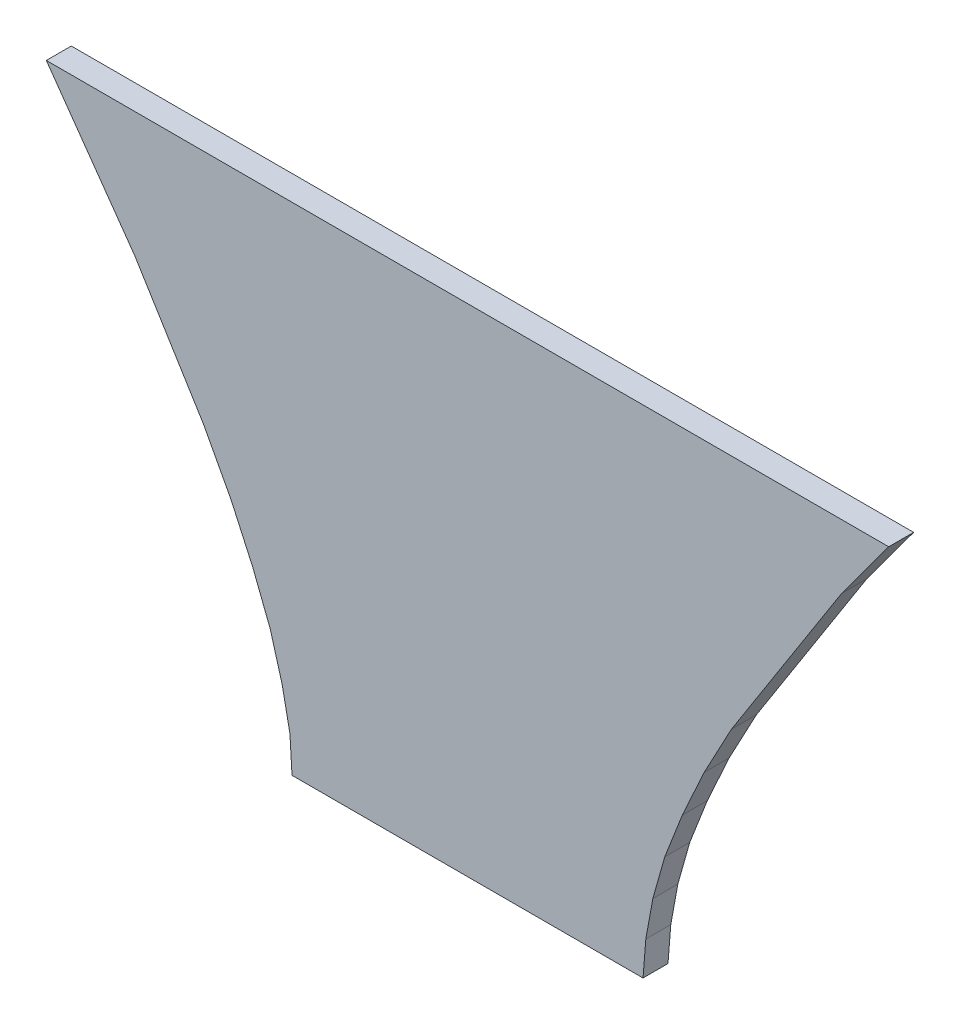
ISO-10303-21;
HEADER;
FILE_DESCRIPTION(('STEP AP214'),'2;1');
FILE_NAME('part.step','',(''),(''),'','','');
FILE_SCHEMA(('AUTOMOTIVE_DESIGN { 1 0 10303 214 1 1 1 1 }'));
ENDSEC;
DATA;
#1=APPLICATION_CONTEXT('core data for automotive mechanical design processes');
#2=APPLICATION_PROTOCOL_DEFINITION('international standard','automotive_design',2000,#1);
#3=PRODUCT_CONTEXT('',#1,'mechanical');
#4=PRODUCT('Part','Part','',(#3));
#5=PRODUCT_RELATED_PRODUCT_CATEGORY('part','',(#4));
#6=PRODUCT_DEFINITION_FORMATION('','',#4);
#7=PRODUCT_DEFINITION_CONTEXT('part definition',#1,'design');
#8=PRODUCT_DEFINITION('design','',#6,#7);
#9=PRODUCT_DEFINITION_SHAPE('','',#8);
#10=(LENGTH_UNIT() NAMED_UNIT(*) SI_UNIT(.MILLI.,.METRE.));
#11=(NAMED_UNIT(*) PLANE_ANGLE_UNIT() SI_UNIT($,.RADIAN.));
#12=(NAMED_UNIT(*) SI_UNIT($,.STERADIAN.) SOLID_ANGLE_UNIT());
#13=UNCERTAINTY_MEASURE_WITH_UNIT(LENGTH_MEASURE(1.E-05),#10,'distance_accuracy_value','');
#14=(GEOMETRIC_REPRESENTATION_CONTEXT(3) GLOBAL_UNCERTAINTY_ASSIGNED_CONTEXT((#13)) GLOBAL_UNIT_ASSIGNED_CONTEXT((#10,
#11,#12)) REPRESENTATION_CONTEXT('',''));
#15=CARTESIAN_POINT('',(0.,0.,0.));
#16=DIRECTION('',(0.,0.,1.));
#17=DIRECTION('',(1.,0.,0.));
#18=AXIS2_PLACEMENT_3D('',#15,#16,#17);
#19=CARTESIAN_POINT('',(94.0810012817383,93.0110015869141,0.));
#20=DIRECTION('',(-0.996818179936028,0.0797089464804637,0.));
#21=DIRECTION('',(0.0797089464804637,0.996818179936028,0.));
#22=AXIS2_PLACEMENT_3D('',#19,#20,#21);
#23=PLANE('',#22);
#24=DIRECTION('',(0.0797089464804637,0.996818179936028,0.));
#25=VECTOR('',#24,1.);
#26=CARTESIAN_POINT('',(94.0810012817383,93.0110015869141,0.03556));
#27=LINE('',#26,#25);
#28=CARTESIAN_POINT('',(94.0810012817383,93.0110015869141,0.03556));
#29=VERTEX_POINT('',#28);
#30=CARTESIAN_POINT('',(94.0849990844727,93.0609970092774,0.03556));
#31=VERTEX_POINT('',#30);
#32=EDGE_CURVE('E11',#29,#31,#27,.T.);
#33=ORIENTED_EDGE('',*,*,#32,.F.);
#34=DIRECTION('',(0.,0.,1.));
#35=VECTOR('',#34,1.);
#36=CARTESIAN_POINT('',(94.0810012817383,93.0110015869141,0.));
#37=LINE('',#36,#35);
#38=CARTESIAN_POINT('',(94.0810012817383,93.0110015869141,0.));
#39=VERTEX_POINT('',#38);
#40=EDGE_CURVE('E24',#39,#29,#37,.T.);
#41=ORIENTED_EDGE('',*,*,#40,.F.);
#42=DIRECTION('',(0.0797089464804637,0.996818179936028,0.));
#43=VECTOR('',#42,1.);
#44=CARTESIAN_POINT('',(94.0810012817383,93.0110015869141,0.));
#45=LINE('',#44,#43);
#46=CARTESIAN_POINT('',(94.0849990844727,93.0609970092774,0.));
#47=VERTEX_POINT('',#46);
#48=EDGE_CURVE('E160',#39,#47,#45,.T.);
#49=ORIENTED_EDGE('',*,*,#48,.T.);
#50=DIRECTION('',(0.,0.,1.));
#51=VECTOR('',#50,1.);
#52=CARTESIAN_POINT('',(94.0849990844727,93.0609970092774,0.));
#53=LINE('',#52,#51);
#54=EDGE_CURVE('E37',#47,#31,#53,.T.);
#55=ORIENTED_EDGE('',*,*,#54,.T.);
#56=EDGE_LOOP('',(#33,#41,#49,#55));
#57=FACE_BOUND('',#56,.T.);
#58=ADVANCED_FACE('F17',(#57),#23,.F.);
#59=CARTESIAN_POINT('',(94.0849990844727,93.0609970092774,0.));
#60=DIRECTION('',(-0.983863358539756,0.178921468032407,0.));
#61=DIRECTION('',(0.178921468032407,0.983863358539756,0.));
#62=AXIS2_PLACEMENT_3D('',#59,#60,#61);
#63=PLANE('',#62);
#64=DIRECTION('',(0.178921468032407,0.983863358539756,0.));
#65=VECTOR('',#64,1.);
#66=CARTESIAN_POINT('',(94.0849990844727,93.0609970092774,0.03556));
#67=LINE('',#66,#65);
#68=CARTESIAN_POINT('',(94.0950012207031,93.1159973144531,0.03556));
#69=VERTEX_POINT('',#68);
#70=EDGE_CURVE('E280',#31,#69,#67,.T.);
#71=ORIENTED_EDGE('',*,*,#70,.F.);
#72=ORIENTED_EDGE('',*,*,#54,.F.);
#73=DIRECTION('',(0.178921468032407,0.983863358539756,0.));
#74=VECTOR('',#73,1.);
#75=CARTESIAN_POINT('',(94.0849990844727,93.0609970092774,0.));
#76=LINE('',#75,#74);
#77=CARTESIAN_POINT('',(94.0950012207031,93.1159973144531,0.));
#78=VERTEX_POINT('',#77);
#79=EDGE_CURVE('E277',#47,#78,#76,.T.);
#80=ORIENTED_EDGE('',*,*,#79,.T.);
#81=DIRECTION('',(0.,0.,1.));
#82=VECTOR('',#81,1.);
#83=CARTESIAN_POINT('',(94.0950012207031,93.1159973144531,0.));
#84=LINE('',#83,#82);
#85=EDGE_CURVE('E275',#78,#69,#84,.T.);
#86=ORIENTED_EDGE('',*,*,#85,.T.);
#87=EDGE_LOOP('',(#71,#72,#80,#86));
#88=FACE_BOUND('',#87,.T.);
#89=ADVANCED_FACE('F288',(#88),#63,.F.);
#90=CARTESIAN_POINT('',(94.0950012207031,93.1159973144531,0.));
#91=DIRECTION('',(-0.962140093901354,0.272555388329589,0.));
#92=DIRECTION('',(0.272555388329589,0.962140093901354,0.));
#93=AXIS2_PLACEMENT_3D('',#90,#91,#92);
#94=PLANE('',#93);
#95=DIRECTION('',(0.272555388329589,0.962140093901354,0.));
#96=VECTOR('',#95,1.);
#97=CARTESIAN_POINT('',(94.0950012207031,93.1159973144531,0.03556));
#98=LINE('',#97,#96);
#99=CARTESIAN_POINT('',(94.1119995117188,93.1760025024414,0.03556));
#100=VERTEX_POINT('',#99);
#101=EDGE_CURVE('E272',#69,#100,#98,.T.);
#102=ORIENTED_EDGE('',*,*,#101,.F.);
#103=ORIENTED_EDGE('',*,*,#85,.F.);
#104=DIRECTION('',(0.272555388329589,0.962140093901354,0.));
#105=VECTOR('',#104,1.);
#106=CARTESIAN_POINT('',(94.0950012207031,93.1159973144531,0.));
#107=LINE('',#106,#105);
#108=CARTESIAN_POINT('',(94.1119995117188,93.1760025024414,0.));
#109=VERTEX_POINT('',#108);
#110=EDGE_CURVE('E269',#78,#109,#107,.T.);
#111=ORIENTED_EDGE('',*,*,#110,.T.);
#112=DIRECTION('',(0.,0.,1.));
#113=VECTOR('',#112,1.);
#114=CARTESIAN_POINT('',(94.1119995117188,93.1760025024414,0.));
#115=LINE('',#114,#113);
#116=EDGE_CURVE('E267',#109,#100,#115,.T.);
#117=ORIENTED_EDGE('',*,*,#116,.T.);
#118=EDGE_LOOP('',(#102,#103,#111,#117));
#119=FACE_BOUND('',#118,.T.);
#120=ADVANCED_FACE('F294',(#119),#94,.F.);
#121=CARTESIAN_POINT('',(94.1119995117188,93.1760025024414,0.));
#122=DIRECTION('',(-0.931440883557046,0.363892677088273,0.));
#123=DIRECTION('',(0.363892677088273,0.931440883557046,0.));
#124=AXIS2_PLACEMENT_3D('',#121,#122,#123);
#125=PLANE('',#124);
#126=DIRECTION('',(0.363892677088273,0.931440883557046,0.));
#127=VECTOR('',#126,1.);
#128=CARTESIAN_POINT('',(94.1119995117188,93.1760025024414,0.03556));
#129=LINE('',#128,#127);
#130=CARTESIAN_POINT('',(94.1370010375977,93.2399978637695,0.03556));
#131=VERTEX_POINT('',#130);
#132=EDGE_CURVE('E264',#100,#131,#129,.T.);
#133=ORIENTED_EDGE('',*,*,#132,.F.);
#134=ORIENTED_EDGE('',*,*,#116,.F.);
#135=DIRECTION('',(0.363892677088273,0.931440883557046,0.));
#136=VECTOR('',#135,1.);
#137=CARTESIAN_POINT('',(94.1119995117188,93.1760025024414,0.));
#138=LINE('',#137,#136);
#139=CARTESIAN_POINT('',(94.1370010375977,93.2399978637695,0.));
#140=VERTEX_POINT('',#139);
#141=EDGE_CURVE('E261',#109,#140,#138,.T.);
#142=ORIENTED_EDGE('',*,*,#141,.T.);
#143=DIRECTION('',(0.,0.,1.));
#144=VECTOR('',#143,1.);
#145=CARTESIAN_POINT('',(94.1370010375977,93.2399978637695,0.));
#146=LINE('',#145,#144);
#147=EDGE_CURVE('E259',#140,#131,#146,.T.);
#148=ORIENTED_EDGE('',*,*,#147,.T.);
#149=EDGE_LOOP('',(#133,#134,#142,#148));
#150=FACE_BOUND('',#149,.T.);
#151=ADVANCED_FACE('F296',(#150),#125,.F.);
#152=CARTESIAN_POINT('',(94.1370010375977,93.2399978637695,0.));
#153=DIRECTION('',(-0.909918432077323,0.414787230958169,0.));
#154=DIRECTION('',(0.414787230958169,0.909918432077323,0.));
#155=AXIS2_PLACEMENT_3D('',#152,#153,#154);
#156=PLANE('',#155);
#157=DIRECTION('',(0.414787230958169,0.909918432077323,0.));
#158=VECTOR('',#157,1.);
#159=CARTESIAN_POINT('',(94.1370010375977,93.2399978637695,0.03556));
#160=LINE('',#159,#158);
#161=CARTESIAN_POINT('',(94.1679992675781,93.3079986572266,0.03556));
#162=VERTEX_POINT('',#161);
#163=EDGE_CURVE('E256',#131,#162,#160,.T.);
#164=ORIENTED_EDGE('',*,*,#163,.F.);
#165=ORIENTED_EDGE('',*,*,#147,.F.);
#166=DIRECTION('',(0.414787230958169,0.909918432077323,0.));
#167=VECTOR('',#166,1.);
#168=CARTESIAN_POINT('',(94.1370010375977,93.2399978637695,0.));
#169=LINE('',#168,#167);
#170=CARTESIAN_POINT('',(94.1679992675781,93.3079986572266,0.));
#171=VERTEX_POINT('',#170);
#172=EDGE_CURVE('E253',#140,#171,#169,.T.);
#173=ORIENTED_EDGE('',*,*,#172,.T.);
#174=DIRECTION('',(0.,0.,1.));
#175=VECTOR('',#174,1.);
#176=CARTESIAN_POINT('',(94.1679992675781,93.3079986572266,0.));
#177=LINE('',#176,#175);
#178=EDGE_CURVE('E251',#171,#162,#177,.T.);
#179=ORIENTED_EDGE('',*,*,#178,.T.);
#180=EDGE_LOOP('',(#164,#165,#173,#179));
#181=FACE_BOUND('',#180,.T.);
#182=ADVANCED_FACE('F301',(#181),#156,.F.);
#183=CARTESIAN_POINT('',(94.1679992675781,93.3079986572266,0.));
#184=DIRECTION('',(-0.882005659864837,0.471238809911062,0.));
#185=DIRECTION('',(0.471238809911062,0.882005659864837,0.));
#186=AXIS2_PLACEMENT_3D('',#183,#184,#185);
#187=PLANE('',#186);
#188=DIRECTION('',(0.471238809911062,0.882005659864837,0.));
#189=VECTOR('',#188,1.);
#190=CARTESIAN_POINT('',(94.1679992675781,93.3079986572266,0.03556));
#191=LINE('',#190,#189);
#192=CARTESIAN_POINT('',(94.2070007324219,93.3809967041016,0.03556));
#193=VERTEX_POINT('',#192);
#194=EDGE_CURVE('E248',#162,#193,#191,.T.);
#195=ORIENTED_EDGE('',*,*,#194,.F.);
#196=ORIENTED_EDGE('',*,*,#178,.F.);
#197=DIRECTION('',(0.471238809911062,0.882005659864837,0.));
#198=VECTOR('',#197,1.);
#199=CARTESIAN_POINT('',(94.1679992675781,93.3079986572266,0.));
#200=LINE('',#199,#198);
#201=CARTESIAN_POINT('',(94.2070007324219,93.3809967041016,0.));
#202=VERTEX_POINT('',#201);
#203=EDGE_CURVE('E245',#171,#202,#200,.T.);
#204=ORIENTED_EDGE('',*,*,#203,.T.);
#205=DIRECTION('',(0.,0.,1.));
#206=VECTOR('',#205,1.);
#207=CARTESIAN_POINT('',(94.2070007324219,93.3809967041016,0.));
#208=LINE('',#207,#206);
#209=EDGE_CURVE('E243',#202,#193,#208,.T.);
#210=ORIENTED_EDGE('',*,*,#209,.T.);
#211=EDGE_LOOP('',(#195,#196,#204,#210));
#212=FACE_BOUND('',#211,.T.);
#213=ADVANCED_FACE('F304',(#212),#187,.F.);
#214=CARTESIAN_POINT('',(94.2070007324219,93.3809967041016,0.));
#215=DIRECTION('',(-0.842961056380981,0.537974588084847,0.));
#216=DIRECTION('',(0.537974588084847,0.842961056380981,0.));
#217=AXIS2_PLACEMENT_3D('',#214,#215,#216);
#218=PLANE('',#217);
#219=DIRECTION('',(0.537974588084847,0.842961056380981,0.));
#220=VECTOR('',#219,1.);
#221=CARTESIAN_POINT('',(94.2070007324219,93.3809967041016,0.03556));
#222=LINE('',#221,#220);
#223=CARTESIAN_POINT('',(94.3639984130859,93.6269989013672,0.03556));
#224=VERTEX_POINT('',#223);
#225=EDGE_CURVE('E240',#193,#224,#222,.T.);
#226=ORIENTED_EDGE('',*,*,#225,.F.);
#227=ORIENTED_EDGE('',*,*,#209,.F.);
#228=DIRECTION('',(0.537974588084847,0.842961056380981,0.));
#229=VECTOR('',#228,1.);
#230=CARTESIAN_POINT('',(94.2070007324219,93.3809967041016,0.));
#231=LINE('',#230,#229);
#232=CARTESIAN_POINT('',(94.3639984130859,93.6269989013672,0.));
#233=VERTEX_POINT('',#232);
#234=EDGE_CURVE('E237',#202,#233,#231,.T.);
#235=ORIENTED_EDGE('',*,*,#234,.T.);
#236=DIRECTION('',(0.,0.,1.));
#237=VECTOR('',#236,1.);
#238=CARTESIAN_POINT('',(94.3639984130859,93.6269989013672,0.));
#239=LINE('',#238,#237);
#240=EDGE_CURVE('E235',#233,#224,#239,.T.);
#241=ORIENTED_EDGE('',*,*,#240,.T.);
#242=EDGE_LOOP('',(#226,#227,#235,#241));
#243=FACE_BOUND('',#242,.T.);
#244=ADVANCED_FACE('F309',(#243),#218,.F.);
#245=CARTESIAN_POINT('',(94.363998413086,93.6269989013672,0.));
#246=DIRECTION('',(-0.805283161541302,0.592890402804805,0.));
#247=DIRECTION('',(0.592890402804805,0.805283161541302,0.));
#248=AXIS2_PLACEMENT_3D('',#245,#246,#247);
#249=PLANE('',#248);
#250=DIRECTION('',(0.592890402804805,0.805283161541302,0.));
#251=VECTOR('',#250,1.);
#252=CARTESIAN_POINT('',(94.3639984130859,93.6269989013672,0.03556));
#253=LINE('',#252,#251);
#254=CARTESIAN_POINT('',(94.4309997558594,93.7180023193359,0.03556));
#255=VERTEX_POINT('',#254);
#256=EDGE_CURVE('E232',#224,#255,#253,.T.);
#257=ORIENTED_EDGE('',*,*,#256,.F.);
#258=ORIENTED_EDGE('',*,*,#240,.F.);
#259=DIRECTION('',(0.592890402804805,0.805283161541302,0.));
#260=VECTOR('',#259,1.);
#261=CARTESIAN_POINT('',(94.3639984130859,93.6269989013672,0.));
#262=LINE('',#261,#260);
#263=CARTESIAN_POINT('',(94.4309997558594,93.7180023193359,0.));
#264=VERTEX_POINT('',#263);
#265=EDGE_CURVE('E229',#233,#264,#262,.T.);
#266=ORIENTED_EDGE('',*,*,#265,.T.);
#267=DIRECTION('',(0.,0.,1.));
#268=VECTOR('',#267,1.);
#269=CARTESIAN_POINT('',(94.4309997558594,93.7180023193359,0.));
#270=LINE('',#269,#268);
#271=EDGE_CURVE('E227',#264,#255,#270,.T.);
#272=ORIENTED_EDGE('',*,*,#271,.T.);
#273=EDGE_LOOP('',(#257,#258,#266,#272));
#274=FACE_BOUND('',#273,.T.);
#275=ADVANCED_FACE('F312',(#274),#249,.F.);
#276=CARTESIAN_POINT('',(94.4309997558594,93.7180023193359,0.));
#277=DIRECTION('',(0.,-1.,0.));
#278=DIRECTION('',(-1.,0.,0.));
#279=AXIS2_PLACEMENT_3D('',#276,#277,#278);
#280=PLANE('',#279);
#281=DIRECTION('',(-1.,0.,0.));
#282=VECTOR('',#281,1.);
#283=CARTESIAN_POINT('',(94.4309997558594,93.7180023193359,0.03556));
#284=LINE('',#283,#282);
#285=CARTESIAN_POINT('',(93.2310028076172,93.7180023193359,0.03556));
#286=VERTEX_POINT('',#285);
#287=EDGE_CURVE('E224',#255,#286,#284,.T.);
#288=ORIENTED_EDGE('',*,*,#287,.F.);
#289=ORIENTED_EDGE('',*,*,#271,.F.);
#290=DIRECTION('',(-1.,0.,0.));
#291=VECTOR('',#290,1.);
#292=CARTESIAN_POINT('',(94.4309997558594,93.7180023193359,0.));
#293=LINE('',#292,#291);
#294=CARTESIAN_POINT('',(93.2310028076172,93.7180023193359,0.));
#295=VERTEX_POINT('',#294);
#296=EDGE_CURVE('E221',#264,#295,#293,.T.);
#297=ORIENTED_EDGE('',*,*,#296,.T.);
#298=DIRECTION('',(0.,0.,1.));
#299=VECTOR('',#298,1.);
#300=CARTESIAN_POINT('',(93.2310028076172,93.7180023193359,0.));
#301=LINE('',#300,#299);
#302=EDGE_CURVE('E219',#295,#286,#301,.T.);
#303=ORIENTED_EDGE('',*,*,#302,.T.);
#304=EDGE_LOOP('',(#288,#289,#297,#303));
#305=FACE_BOUND('',#304,.T.);
#306=ADVANCED_FACE('F317',(#305),#280,.F.);
#307=CARTESIAN_POINT('',(93.2310028076172,93.7180023193359,0.));
#308=DIRECTION('',(0.816208014118673,0.577758148093519,0.));
#309=DIRECTION('',(0.577758148093519,-0.816208014118673,0.));
#310=AXIS2_PLACEMENT_3D('',#307,#308,#309);
#311=PLANE('',#310);
#312=DIRECTION('',(0.577758148093519,-0.816208014118673,0.));
#313=VECTOR('',#312,1.);
#314=CARTESIAN_POINT('',(93.2310028076172,93.7180023193359,0.03556));
#315=LINE('',#314,#313);
#316=CARTESIAN_POINT('',(93.3570022583008,93.5400009155273,0.03556));
#317=VERTEX_POINT('',#316);
#318=EDGE_CURVE('E216',#286,#317,#315,.T.);
#319=ORIENTED_EDGE('',*,*,#318,.F.);
#320=ORIENTED_EDGE('',*,*,#302,.F.);
#321=DIRECTION('',(0.577758148093519,-0.816208014118673,0.));
#322=VECTOR('',#321,1.);
#323=CARTESIAN_POINT('',(93.2310028076172,93.7180023193359,0.));
#324=LINE('',#323,#322);
#325=CARTESIAN_POINT('',(93.3570022583008,93.5400009155273,0.));
#326=VERTEX_POINT('',#325);
#327=EDGE_CURVE('E213',#295,#326,#324,.T.);
#328=ORIENTED_EDGE('',*,*,#327,.T.);
#329=DIRECTION('',(0.,0.,1.));
#330=VECTOR('',#329,1.);
#331=CARTESIAN_POINT('',(93.3570022583008,93.5400009155273,0.));
#332=LINE('',#331,#330);
#333=EDGE_CURVE('E211',#326,#317,#332,.T.);
#334=ORIENTED_EDGE('',*,*,#333,.T.);
#335=EDGE_LOOP('',(#319,#320,#328,#334));
#336=FACE_BOUND('',#335,.T.);
#337=ADVANCED_FACE('F320',(#336),#311,.F.);
#338=CARTESIAN_POINT('',(93.3570022583008,93.5400009155273,0.));
#339=DIRECTION('',(0.851297677702986,0.524683012815837,0.));
#340=DIRECTION('',(0.524683012815837,-0.851297677702986,0.));
#341=AXIS2_PLACEMENT_3D('',#338,#339,#340);
#342=PLANE('',#341);
#343=DIRECTION('',(0.524683012815837,-0.851297677702986,0.));
#344=VECTOR('',#343,1.);
#345=CARTESIAN_POINT('',(93.3570022583008,93.5400009155273,0.03556));
#346=LINE('',#345,#344);
#347=CARTESIAN_POINT('',(93.4550018310547,93.3809967041016,0.03556));
#348=VERTEX_POINT('',#347);
#349=EDGE_CURVE('E208',#317,#348,#346,.T.);
#350=ORIENTED_EDGE('',*,*,#349,.F.);
#351=ORIENTED_EDGE('',*,*,#333,.F.);
#352=DIRECTION('',(0.524683012815837,-0.851297677702986,0.));
#353=VECTOR('',#352,1.);
#354=CARTESIAN_POINT('',(93.3570022583008,93.5400009155273,0.));
#355=LINE('',#354,#353);
#356=CARTESIAN_POINT('',(93.4550018310547,93.3809967041016,0.));
#357=VERTEX_POINT('',#356);
#358=EDGE_CURVE('E205',#326,#357,#355,.T.);
#359=ORIENTED_EDGE('',*,*,#358,.T.);
#360=DIRECTION('',(0.,0.,1.));
#361=VECTOR('',#360,1.);
#362=CARTESIAN_POINT('',(93.4550018310547,93.3809967041016,0.));
#363=LINE('',#362,#361);
#364=EDGE_CURVE('E203',#357,#348,#363,.T.);
#365=ORIENTED_EDGE('',*,*,#364,.T.);
#366=EDGE_LOOP('',(#350,#351,#359,#365));
#367=FACE_BOUND('',#366,.T.);
#368=ADVANCED_FACE('F325',(#367),#342,.F.);
#369=CARTESIAN_POINT('',(93.4550018310547,93.3809967041016,0.));
#370=DIRECTION('',(0.882005659864837,0.471238809911062,0.));
#371=DIRECTION('',(0.471238809911062,-0.882005659864837,0.));
#372=AXIS2_PLACEMENT_3D('',#369,#370,#371);
#373=PLANE('',#372);
#374=DIRECTION('',(0.471238809911062,-0.882005659864837,0.));
#375=VECTOR('',#374,1.);
#376=CARTESIAN_POINT('',(93.4550018310547,93.3809967041016,0.03556));
#377=LINE('',#376,#375);
#378=CARTESIAN_POINT('',(93.4940032958984,93.3079986572266,0.03556));
#379=VERTEX_POINT('',#378);
#380=EDGE_CURVE('E200',#348,#379,#377,.T.);
#381=ORIENTED_EDGE('',*,*,#380,.F.);
#382=ORIENTED_EDGE('',*,*,#364,.F.);
#383=DIRECTION('',(0.471238809911062,-0.882005659864837,0.));
#384=VECTOR('',#383,1.);
#385=CARTESIAN_POINT('',(93.4550018310547,93.3809967041016,0.));
#386=LINE('',#385,#384);
#387=CARTESIAN_POINT('',(93.4940032958984,93.3079986572266,0.));
#388=VERTEX_POINT('',#387);
#389=EDGE_CURVE('E197',#357,#388,#386,.T.);
#390=ORIENTED_EDGE('',*,*,#389,.T.);
#391=DIRECTION('',(0.,0.,1.));
#392=VECTOR('',#391,1.);
#393=CARTESIAN_POINT('',(93.4940032958984,93.3079986572266,0.));
#394=LINE('',#393,#392);
#395=EDGE_CURVE('E195',#388,#379,#394,.T.);
#396=ORIENTED_EDGE('',*,*,#395,.T.);
#397=EDGE_LOOP('',(#381,#382,#390,#396));
#398=FACE_BOUND('',#397,.T.);
#399=ADVANCED_FACE('F328',(#398),#373,.F.);
#400=CARTESIAN_POINT('',(93.4940032958984,93.3079986572266,0.));
#401=DIRECTION('',(0.909918432077323,0.414787230958169,0.));
#402=DIRECTION('',(0.414787230958169,-0.909918432077323,0.));
#403=AXIS2_PLACEMENT_3D('',#400,#401,#402);
#404=PLANE('',#403);
#405=DIRECTION('',(0.414787230958169,-0.909918432077323,0.));
#406=VECTOR('',#405,1.);
#407=CARTESIAN_POINT('',(93.4940032958984,93.3079986572266,0.03556));
#408=LINE('',#407,#406);
#409=CARTESIAN_POINT('',(93.5250015258789,93.2399978637695,0.03556));
#410=VERTEX_POINT('',#409);
#411=EDGE_CURVE('E192',#379,#410,#408,.T.);
#412=ORIENTED_EDGE('',*,*,#411,.F.);
#413=ORIENTED_EDGE('',*,*,#395,.F.);
#414=DIRECTION('',(0.414787230958169,-0.909918432077323,0.));
#415=VECTOR('',#414,1.);
#416=CARTESIAN_POINT('',(93.4940032958984,93.3079986572266,0.));
#417=LINE('',#416,#415);
#418=CARTESIAN_POINT('',(93.5250015258789,93.2399978637695,0.));
#419=VERTEX_POINT('',#418);
#420=EDGE_CURVE('E189',#388,#419,#417,.T.);
#421=ORIENTED_EDGE('',*,*,#420,.T.);
#422=DIRECTION('',(0.,0.,1.));
#423=VECTOR('',#422,1.);
#424=CARTESIAN_POINT('',(93.5250015258789,93.2399978637695,0.));
#425=LINE('',#424,#423);
#426=EDGE_CURVE('E187',#419,#410,#425,.T.);
#427=ORIENTED_EDGE('',*,*,#426,.T.);
#428=EDGE_LOOP('',(#412,#413,#421,#427));
#429=FACE_BOUND('',#428,.T.);
#430=ADVANCED_FACE('F333',(#429),#404,.F.);
#431=CARTESIAN_POINT('',(93.5250015258789,93.2399978637695,0.));
#432=DIRECTION('',(0.931440883557046,0.363892677088273,0.));
#433=DIRECTION('',(0.363892677088273,-0.931440883557046,0.));
#434=AXIS2_PLACEMENT_3D('',#431,#432,#433);
#435=PLANE('',#434);
#436=DIRECTION('',(0.363892677088273,-0.931440883557046,0.));
#437=VECTOR('',#436,1.);
#438=CARTESIAN_POINT('',(93.5250015258789,93.2399978637695,0.03556));
#439=LINE('',#438,#437);
#440=CARTESIAN_POINT('',(93.5500030517578,93.1760025024414,0.03556));
#441=VERTEX_POINT('',#440);
#442=EDGE_CURVE('E184',#410,#441,#439,.T.);
#443=ORIENTED_EDGE('',*,*,#442,.F.);
#444=ORIENTED_EDGE('',*,*,#426,.F.);
#445=DIRECTION('',(0.363892677088273,-0.931440883557046,0.));
#446=VECTOR('',#445,1.);
#447=CARTESIAN_POINT('',(93.5250015258789,93.2399978637695,0.));
#448=LINE('',#447,#446);
#449=CARTESIAN_POINT('',(93.5500030517578,93.1760025024414,0.));
#450=VERTEX_POINT('',#449);
#451=EDGE_CURVE('E181',#419,#450,#448,.T.);
#452=ORIENTED_EDGE('',*,*,#451,.T.);
#453=DIRECTION('',(0.,0.,1.));
#454=VECTOR('',#453,1.);
#455=CARTESIAN_POINT('',(93.5500030517578,93.1760025024414,0.));
#456=LINE('',#455,#454);
#457=EDGE_CURVE('E179',#450,#441,#456,.T.);
#458=ORIENTED_EDGE('',*,*,#457,.T.);
#459=EDGE_LOOP('',(#443,#444,#452,#458));
#460=FACE_BOUND('',#459,.T.);
#461=ADVANCED_FACE('F336',(#460),#435,.F.);
#462=CARTESIAN_POINT('',(93.5500030517578,93.1760025024414,0.));
#463=DIRECTION('',(0.962140093901354,0.272555388329589,0.));
#464=DIRECTION('',(0.272555388329589,-0.962140093901354,0.));
#465=AXIS2_PLACEMENT_3D('',#462,#463,#464);
#466=PLANE('',#465);
#467=DIRECTION('',(0.272555388329589,-0.962140093901354,0.));
#468=VECTOR('',#467,1.);
#469=CARTESIAN_POINT('',(93.5500030517578,93.1760025024414,0.03556));
#470=LINE('',#469,#468);
#471=CARTESIAN_POINT('',(93.5670013427734,93.1159973144531,0.03556));
#472=VERTEX_POINT('',#471);
#473=EDGE_CURVE('E176',#441,#472,#470,.T.);
#474=ORIENTED_EDGE('',*,*,#473,.F.);
#475=ORIENTED_EDGE('',*,*,#457,.F.);
#476=DIRECTION('',(0.272555388329589,-0.962140093901354,0.));
#477=VECTOR('',#476,1.);
#478=CARTESIAN_POINT('',(93.5500030517578,93.1760025024414,0.));
#479=LINE('',#478,#477);
#480=CARTESIAN_POINT('',(93.5670013427734,93.1159973144531,0.));
#481=VERTEX_POINT('',#480);
#482=EDGE_CURVE('E173',#450,#481,#479,.T.);
#483=ORIENTED_EDGE('',*,*,#482,.T.);
#484=DIRECTION('',(0.,0.,1.));
#485=VECTOR('',#484,1.);
#486=CARTESIAN_POINT('',(93.5670013427734,93.1159973144531,0.));
#487=LINE('',#486,#485);
#488=EDGE_CURVE('E171',#481,#472,#487,.T.);
#489=ORIENTED_EDGE('',*,*,#488,.T.);
#490=EDGE_LOOP('',(#474,#475,#483,#489));
#491=FACE_BOUND('',#490,.T.);
#492=ADVANCED_FACE('F341',(#491),#466,.F.);
#493=CARTESIAN_POINT('',(93.5670013427735,93.1159973144531,0.));
#494=DIRECTION('',(0.980575443764812,0.196142292954482,0.));
#495=DIRECTION('',(0.196142292954482,-0.980575443764812,0.));
#496=AXIS2_PLACEMENT_3D('',#493,#494,#495);
#497=PLANE('',#496);
#498=DIRECTION('',(0.196142292954482,-0.980575443764812,0.));
#499=VECTOR('',#498,1.);
#500=CARTESIAN_POINT('',(93.5670013427734,93.1159973144531,0.03556));
#501=LINE('',#500,#499);
#502=CARTESIAN_POINT('',(93.5780029296875,93.0609970092774,0.03556));
#503=VERTEX_POINT('',#502);
#504=EDGE_CURVE('E168',#472,#503,#501,.T.);
#505=ORIENTED_EDGE('',*,*,#504,.F.);
#506=ORIENTED_EDGE('',*,*,#488,.F.);
#507=DIRECTION('',(0.196142292954482,-0.980575443764812,0.));
#508=VECTOR('',#507,1.);
#509=CARTESIAN_POINT('',(93.5670013427734,93.1159973144531,0.));
#510=LINE('',#509,#508);
#511=CARTESIAN_POINT('',(93.5780029296875,93.0609970092774,0.));
#512=VERTEX_POINT('',#511);
#513=EDGE_CURVE('E166',#481,#512,#510,.T.);
#514=ORIENTED_EDGE('',*,*,#513,.T.);
#515=DIRECTION('',(0.,0.,1.));
#516=VECTOR('',#515,1.);
#517=CARTESIAN_POINT('',(93.5780029296875,93.0609970092774,0.));
#518=LINE('',#517,#516);
#519=EDGE_CURVE('E151',#512,#503,#518,.T.);
#520=ORIENTED_EDGE('',*,*,#519,.T.);
#521=EDGE_LOOP('',(#505,#506,#514,#520));
#522=FACE_BOUND('',#521,.T.);
#523=ADVANCED_FACE('F343',(#522),#497,.F.);
#524=CARTESIAN_POINT('',(93.5780029296875,93.0609970092774,0.));
#525=DIRECTION('',(0.998206484334836,0.0598649699898658,0.));
#526=DIRECTION('',(0.0598649699898658,-0.998206484334836,0.));
#527=AXIS2_PLACEMENT_3D('',#524,#525,#526);
#528=PLANE('',#527);
#529=DIRECTION('',(0.0598649699898658,-0.998206484334836,0.));
#530=VECTOR('',#529,1.);
#531=CARTESIAN_POINT('',(93.5780029296875,93.0609970092774,0.03556));
#532=LINE('',#531,#530);
#533=CARTESIAN_POINT('',(93.5810012817383,93.0110015869141,0.03556));
#534=VERTEX_POINT('',#533);
#535=EDGE_CURVE('E155',#503,#534,#532,.T.);
#536=ORIENTED_EDGE('',*,*,#535,.F.);
#537=ORIENTED_EDGE('',*,*,#519,.F.);
#538=DIRECTION('',(0.0598649699898658,-0.998206484334836,0.));
#539=VECTOR('',#538,1.);
#540=CARTESIAN_POINT('',(93.5780029296875,93.0609970092774,0.));
#541=LINE('',#540,#539);
#542=CARTESIAN_POINT('',(93.5810012817383,93.0110015869141,0.));
#543=VERTEX_POINT('',#542);
#544=EDGE_CURVE('E147',#512,#543,#541,.T.);
#545=ORIENTED_EDGE('',*,*,#544,.T.);
#546=DIRECTION('',(0.,0.,1.));
#547=VECTOR('',#546,1.);
#548=CARTESIAN_POINT('',(93.5810012817383,93.0110015869141,0.));
#549=LINE('',#548,#547);
#550=EDGE_CURVE('E137',#543,#534,#549,.T.);
#551=ORIENTED_EDGE('',*,*,#550,.T.);
#552=EDGE_LOOP('',(#536,#537,#545,#551));
#553=FACE_BOUND('',#552,.T.);
#554=ADVANCED_FACE('F150',(#553),#528,.F.);
#555=CARTESIAN_POINT('',(93.5810012817383,93.0110015869141,0.));
#556=DIRECTION('',(0.,1.,0.));
#557=DIRECTION('',(1.,0.,0.));
#558=AXIS2_PLACEMENT_3D('',#555,#556,#557);
#559=PLANE('',#558);
#560=DIRECTION('',(1.,0.,0.));
#561=VECTOR('',#560,1.);
#562=CARTESIAN_POINT('',(93.5810012817383,93.0110015869141,0.03556));
#563=LINE('',#562,#561);
#564=EDGE_CURVE('E143',#534,#29,#563,.T.);
#565=ORIENTED_EDGE('',*,*,#564,.F.);
#566=ORIENTED_EDGE('',*,*,#550,.F.);
#567=DIRECTION('',(1.,0.,0.));
#568=VECTOR('',#567,1.);
#569=CARTESIAN_POINT('',(93.5810012817383,93.0110015869141,0.));
#570=LINE('',#569,#568);
#571=EDGE_CURVE('E141',#543,#39,#570,.T.);
#572=ORIENTED_EDGE('',*,*,#571,.T.);
#573=ORIENTED_EDGE('',*,*,#40,.T.);
#574=EDGE_LOOP('',(#565,#566,#572,#573));
#575=FACE_BOUND('',#574,.T.);
#576=ADVANCED_FACE('F139',(#575),#559,.F.);
#577=CARTESIAN_POINT('',(94.0810012817383,93.0110015869141,0.));
#578=DIRECTION('',(0.,0.,1.));
#579=DIRECTION('',(1.,0.,0.));
#580=AXIS2_PLACEMENT_3D('',#577,#578,#579);
#581=PLANE('',#580);
#582=ORIENTED_EDGE('',*,*,#571,.F.);
#583=ORIENTED_EDGE('',*,*,#544,.F.);
#584=ORIENTED_EDGE('',*,*,#513,.F.);
#585=ORIENTED_EDGE('',*,*,#482,.F.);
#586=ORIENTED_EDGE('',*,*,#451,.F.);
#587=ORIENTED_EDGE('',*,*,#420,.F.);
#588=ORIENTED_EDGE('',*,*,#389,.F.);
#589=ORIENTED_EDGE('',*,*,#358,.F.);
#590=ORIENTED_EDGE('',*,*,#327,.F.);
#591=ORIENTED_EDGE('',*,*,#296,.F.);
#592=ORIENTED_EDGE('',*,*,#265,.F.);
#593=ORIENTED_EDGE('',*,*,#234,.F.);
#594=ORIENTED_EDGE('',*,*,#203,.F.);
#595=ORIENTED_EDGE('',*,*,#172,.F.);
#596=ORIENTED_EDGE('',*,*,#141,.F.);
#597=ORIENTED_EDGE('',*,*,#110,.F.);
#598=ORIENTED_EDGE('',*,*,#79,.F.);
#599=ORIENTED_EDGE('',*,*,#48,.F.);
#600=EDGE_LOOP('',(#582,#583,#584,#585,#586,#587,#588,#589,#590,#591,#592,#593,#594,#595,#596,
#597,#598,#599));
#601=FACE_BOUND('',#600,.T.);
#602=ADVANCED_FACE('F158',(#601),#581,.F.);
#603=CARTESIAN_POINT('',(94.0810012817383,93.0110015869141,0.03556));
#604=DIRECTION('',(0.,0.,1.));
#605=DIRECTION('',(1.,0.,0.));
#606=AXIS2_PLACEMENT_3D('',#603,#604,#605);
#607=PLANE('',#606);
#608=ORIENTED_EDGE('',*,*,#32,.T.);
#609=ORIENTED_EDGE('',*,*,#70,.T.);
#610=ORIENTED_EDGE('',*,*,#101,.T.);
#611=ORIENTED_EDGE('',*,*,#132,.T.);
#612=ORIENTED_EDGE('',*,*,#163,.T.);
#613=ORIENTED_EDGE('',*,*,#194,.T.);
#614=ORIENTED_EDGE('',*,*,#225,.T.);
#615=ORIENTED_EDGE('',*,*,#256,.T.);
#616=ORIENTED_EDGE('',*,*,#287,.T.);
#617=ORIENTED_EDGE('',*,*,#318,.T.);
#618=ORIENTED_EDGE('',*,*,#349,.T.);
#619=ORIENTED_EDGE('',*,*,#380,.T.);
#620=ORIENTED_EDGE('',*,*,#411,.T.);
#621=ORIENTED_EDGE('',*,*,#442,.T.);
#622=ORIENTED_EDGE('',*,*,#473,.T.);
#623=ORIENTED_EDGE('',*,*,#504,.T.);
#624=ORIENTED_EDGE('',*,*,#535,.T.);
#625=ORIENTED_EDGE('',*,*,#564,.T.);
#626=EDGE_LOOP('',(#608,#609,#610,#611,#612,#613,#614,#615,#616,#617,#618,#619,#620,#621,#622,
#623,#624,#625));
#627=FACE_BOUND('',#626,.T.);
#628=ADVANCED_FACE('F291',(#627),#607,.T.);
#629=CLOSED_SHELL('',(#58,#89,#120,#151,#182,#213,#244,#275,#306,#337,#368,#399,#430,#461,#492,
#523,#554,#576,#602,#628));
#630=MANIFOLD_SOLID_BREP('B1',#629);
#631=ADVANCED_BREP_SHAPE_REPRESENTATION('',(#18,#630),#14);
#632=SHAPE_DEFINITION_REPRESENTATION(#9,#631);
ENDSEC;
END-ISO-10303-21;
